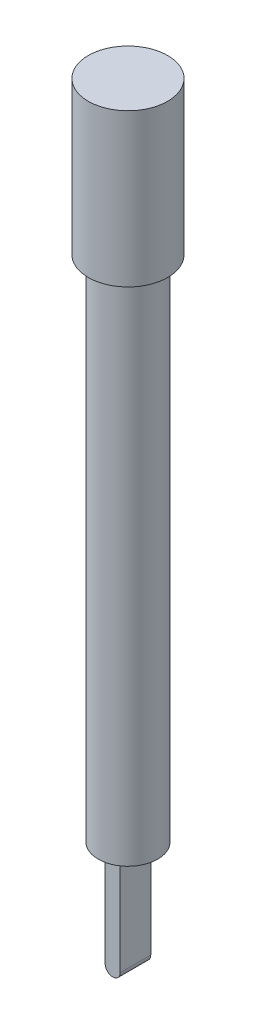
ISO-10303-21;
HEADER;
FILE_DESCRIPTION(('STEP AP214'),'2;1');
FILE_NAME('part.step','',(''),(''),'','','');
FILE_SCHEMA(('AUTOMOTIVE_DESIGN { 1 0 10303 214 1 1 1 1 }'));
ENDSEC;
DATA;
#1=APPLICATION_CONTEXT('core data for automotive mechanical design processes');
#2=APPLICATION_PROTOCOL_DEFINITION('international standard','automotive_design',2000,#1);
#3=PRODUCT_CONTEXT('',#1,'mechanical');
#4=PRODUCT('Part','Part','',(#3));
#5=PRODUCT_RELATED_PRODUCT_CATEGORY('part','',(#4));
#6=PRODUCT_DEFINITION_FORMATION('','',#4);
#7=PRODUCT_DEFINITION_CONTEXT('part definition',#1,'design');
#8=PRODUCT_DEFINITION('design','',#6,#7);
#9=PRODUCT_DEFINITION_SHAPE('','',#8);
#10=(LENGTH_UNIT() NAMED_UNIT(*) SI_UNIT(.MILLI.,.METRE.));
#11=(NAMED_UNIT(*) PLANE_ANGLE_UNIT() SI_UNIT($,.RADIAN.));
#12=(NAMED_UNIT(*) SI_UNIT($,.STERADIAN.) SOLID_ANGLE_UNIT());
#13=UNCERTAINTY_MEASURE_WITH_UNIT(LENGTH_MEASURE(1.E-05),#10,'distance_accuracy_value','');
#14=(GEOMETRIC_REPRESENTATION_CONTEXT(3) GLOBAL_UNCERTAINTY_ASSIGNED_CONTEXT((#13)) GLOBAL_UNIT_ASSIGNED_CONTEXT((#10,
#11,#12)) REPRESENTATION_CONTEXT('',''));
#15=CARTESIAN_POINT('',(0.,0.,0.));
#16=DIRECTION('',(0.,0.,1.));
#17=DIRECTION('',(1.,0.,0.));
#18=AXIS2_PLACEMENT_3D('',#15,#16,#17);
#19=CARTESIAN_POINT('',(0.,100.,0.));
#20=DIRECTION('',(0.,-1.,0.));
#21=DIRECTION('',(0.,0.,-1.));
#22=AXIS2_PLACEMENT_3D('',#19,#20,#21);
#23=CYLINDRICAL_SURFACE('',#22,5.85);
#24=CARTESIAN_POINT('',(0.,100.,0.));
#25=DIRECTION('',(0.,1.,0.));
#26=DIRECTION('',(0.,0.,1.));
#27=AXIS2_PLACEMENT_3D('',#24,#25,#26);
#28=CIRCLE('',#27,5.85);
#29=CARTESIAN_POINT('',(0.,100.,5.85));
#30=VERTEX_POINT('',#29);
#31=EDGE_CURVE('E11',#30,#30,#28,.T.);
#32=ORIENTED_EDGE('',*,*,#31,.F.);
#33=EDGE_LOOP('',(#32));
#34=FACE_BOUND('',#33,.T.);
#35=CARTESIAN_POINT('',(0.,0.,0.));
#36=DIRECTION('',(0.,1.,0.));
#37=DIRECTION('',(0.,0.,1.));
#38=AXIS2_PLACEMENT_3D('',#35,#36,#37);
#39=CIRCLE('',#38,5.85);
#40=CARTESIAN_POINT('',(0.,0.,5.85));
#41=VERTEX_POINT('',#40);
#42=EDGE_CURVE('E38',#41,#41,#39,.T.);
#43=ORIENTED_EDGE('',*,*,#42,.T.);
#44=EDGE_LOOP('',(#43));
#45=FACE_BOUND('',#44,.T.);
#46=ADVANCED_FACE('F35',(#34,#45),#23,.T.);
#47=CARTESIAN_POINT('',(0.,0.,0.));
#48=DIRECTION('',(0.,1.,0.));
#49=DIRECTION('',(0.,0.,1.));
#50=AXIS2_PLACEMENT_3D('',#47,#48,#49);
#51=PLANE('',#50);
#52=DIRECTION('',(1.,0.,0.));
#53=VECTOR('',#52,1.);
#54=CARTESIAN_POINT('',(0.,0.,-3.));
#55=LINE('',#54,#53);
#56=CARTESIAN_POINT('',(-1.47838716267318,0.,-3.));
#57=VERTEX_POINT('',#56);
#58=CARTESIAN_POINT('',(1.47838716267318,0.,-3.));
#59=VERTEX_POINT('',#58);
#60=EDGE_CURVE('E84',#57,#59,#55,.T.);
#61=ORIENTED_EDGE('',*,*,#60,.F.);
#62=DIRECTION('',(0.,0.,1.));
#63=VECTOR('',#62,1.);
#64=CARTESIAN_POINT('',(-1.47838716267318,0.,-3.));
#65=LINE('',#64,#63);
#66=CARTESIAN_POINT('',(-1.47838716267318,0.,3.));
#67=VERTEX_POINT('',#66);
#68=EDGE_CURVE('E49',#57,#67,#65,.T.);
#69=ORIENTED_EDGE('',*,*,#68,.T.);
#70=DIRECTION('',(1.,0.,0.));
#71=VECTOR('',#70,1.);
#72=CARTESIAN_POINT('',(0.,0.,3.));
#73=LINE('',#72,#71);
#74=CARTESIAN_POINT('',(1.47838716267318,0.,3.));
#75=VERTEX_POINT('',#74);
#76=EDGE_CURVE('E54',#67,#75,#73,.T.);
#77=ORIENTED_EDGE('',*,*,#76,.T.);
#78=DIRECTION('',(0.,0.,1.));
#79=VECTOR('',#78,1.);
#80=CARTESIAN_POINT('',(1.47838716267318,0.,-3.));
#81=LINE('',#80,#79);
#82=EDGE_CURVE('E109',#59,#75,#81,.T.);
#83=ORIENTED_EDGE('',*,*,#82,.F.);
#84=EDGE_LOOP('',(#61,#69,#77,#83));
#85=FACE_BOUND('',#84,.T.);
#86=ORIENTED_EDGE('',*,*,#42,.F.);
#87=EDGE_LOOP('',(#86));
#88=FACE_BOUND('',#87,.T.);
#89=ADVANCED_FACE('F135',(#85,#88),#51,.F.);
#90=CARTESIAN_POINT('',(0.,130.,0.));
#91=DIRECTION('',(0.,-1.,0.));
#92=DIRECTION('',(0.,0.,-1.));
#93=AXIS2_PLACEMENT_3D('',#90,#91,#92);
#94=CYLINDRICAL_SURFACE('',#93,7.8);
#95=CARTESIAN_POINT('',(0.,130.,0.));
#96=DIRECTION('',(0.,1.,0.));
#97=DIRECTION('',(0.,0.,1.));
#98=AXIS2_PLACEMENT_3D('',#95,#96,#97);
#99=CIRCLE('',#98,7.8);
#100=CARTESIAN_POINT('',(0.,130.,7.8));
#101=VERTEX_POINT('',#100);
#102=EDGE_CURVE('E112',#101,#101,#99,.T.);
#103=ORIENTED_EDGE('',*,*,#102,.F.);
#104=EDGE_LOOP('',(#103));
#105=FACE_BOUND('',#104,.T.);
#106=CARTESIAN_POINT('',(0.,100.,0.));
#107=DIRECTION('',(0.,1.,0.));
#108=DIRECTION('',(0.,0.,1.));
#109=AXIS2_PLACEMENT_3D('',#106,#107,#108);
#110=CIRCLE('',#109,7.8);
#111=CARTESIAN_POINT('',(0.,100.,7.8));
#112=VERTEX_POINT('',#111);
#113=EDGE_CURVE('E108',#112,#112,#110,.T.);
#114=ORIENTED_EDGE('',*,*,#113,.T.);
#115=EDGE_LOOP('',(#114));
#116=FACE_BOUND('',#115,.T.);
#117=ADVANCED_FACE('F118',(#105,#116),#94,.T.);
#118=CARTESIAN_POINT('',(0.,130.,0.));
#119=DIRECTION('',(0.,1.,0.));
#120=DIRECTION('',(0.,0.,1.));
#121=AXIS2_PLACEMENT_3D('',#118,#119,#120);
#122=PLANE('',#121);
#123=ORIENTED_EDGE('',*,*,#102,.T.);
#124=EDGE_LOOP('',(#123));
#125=FACE_BOUND('',#124,.T.);
#126=ADVANCED_FACE('F122',(#125),#122,.T.);
#127=CARTESIAN_POINT('',(0.,100.,0.));
#128=DIRECTION('',(0.,1.,0.));
#129=DIRECTION('',(0.,0.,1.));
#130=AXIS2_PLACEMENT_3D('',#127,#128,#129);
#131=PLANE('',#130);
#132=ORIENTED_EDGE('',*,*,#31,.T.);
#133=EDGE_LOOP('',(#132));
#134=FACE_BOUND('',#133,.T.);
#135=ORIENTED_EDGE('',*,*,#113,.F.);
#136=EDGE_LOOP('',(#135));
#137=FACE_BOUND('',#136,.T.);
#138=ADVANCED_FACE('F120',(#134,#137),#131,.F.);
#139=CARTESIAN_POINT('',(-1.47838716267318,0.,-3.));
#140=DIRECTION('',(1.,0.,0.));
#141=DIRECTION('',(0.,1.,0.));
#142=AXIS2_PLACEMENT_3D('',#139,#140,#141);
#143=PLANE('',#142);
#144=DIRECTION('',(0.,0.,1.));
#145=VECTOR('',#144,1.);
#146=CARTESIAN_POINT('',(-1.47838716267318,-20.,-3.));
#147=LINE('',#146,#145);
#148=CARTESIAN_POINT('',(-1.47838716267318,-20.,-3.));
#149=VERTEX_POINT('',#148);
#150=CARTESIAN_POINT('',(-1.47838716267318,-20.,3.));
#151=VERTEX_POINT('',#150);
#152=EDGE_CURVE('E73',#149,#151,#147,.T.);
#153=ORIENTED_EDGE('',*,*,#152,.T.);
#154=DIRECTION('',(0.,1.,0.));
#155=VECTOR('',#154,1.);
#156=CARTESIAN_POINT('',(-1.47838716267318,0.,3.));
#157=LINE('',#156,#155);
#158=EDGE_CURVE('E77',#151,#67,#157,.T.);
#159=ORIENTED_EDGE('',*,*,#158,.T.);
#160=ORIENTED_EDGE('',*,*,#68,.F.);
#161=DIRECTION('',(0.,1.,0.));
#162=VECTOR('',#161,1.);
#163=CARTESIAN_POINT('',(-1.47838716267318,0.,-3.));
#164=LINE('',#163,#162);
#165=EDGE_CURVE('E79',#149,#57,#164,.T.);
#166=ORIENTED_EDGE('',*,*,#165,.F.);
#167=EDGE_LOOP('',(#153,#159,#160,#166));
#168=FACE_BOUND('',#167,.T.);
#169=ADVANCED_FACE('F75',(#168),#143,.F.);
#170=CARTESIAN_POINT('',(1.47838716267318,0.,-3.));
#171=DIRECTION('',(-1.,0.,0.));
#172=DIRECTION('',(0.,-1.,0.));
#173=AXIS2_PLACEMENT_3D('',#170,#171,#172);
#174=PLANE('',#173);
#175=ORIENTED_EDGE('',*,*,#82,.T.);
#176=DIRECTION('',(0.,-1.,0.));
#177=VECTOR('',#176,1.);
#178=CARTESIAN_POINT('',(1.47838716267318,0.,3.));
#179=LINE('',#178,#177);
#180=CARTESIAN_POINT('',(1.47838716267318,-20.,3.));
#181=VERTEX_POINT('',#180);
#182=EDGE_CURVE('E93',#75,#181,#179,.T.);
#183=ORIENTED_EDGE('',*,*,#182,.T.);
#184=DIRECTION('',(0.,0.,1.));
#185=VECTOR('',#184,1.);
#186=CARTESIAN_POINT('',(1.47838716267318,-20.,-3.));
#187=LINE('',#186,#185);
#188=CARTESIAN_POINT('',(1.47838716267318,-20.,-3.));
#189=VERTEX_POINT('',#188);
#190=EDGE_CURVE('E83',#189,#181,#187,.T.);
#191=ORIENTED_EDGE('',*,*,#190,.F.);
#192=DIRECTION('',(0.,-1.,0.));
#193=VECTOR('',#192,1.);
#194=CARTESIAN_POINT('',(1.47838716267318,0.,-3.));
#195=LINE('',#194,#193);
#196=EDGE_CURVE('E103',#59,#189,#195,.T.);
#197=ORIENTED_EDGE('',*,*,#196,.F.);
#198=EDGE_LOOP('',(#175,#183,#191,#197));
#199=FACE_BOUND('',#198,.T.);
#200=ADVANCED_FACE('F129',(#199),#174,.F.);
#201=CARTESIAN_POINT('',(0.,-20.,-3.));
#202=DIRECTION('',(0.,0.,1.));
#203=DIRECTION('',(1.,0.,0.));
#204=AXIS2_PLACEMENT_3D('',#201,#202,#203);
#205=CYLINDRICAL_SURFACE('',#204,1.47838716267318);
#206=ORIENTED_EDGE('',*,*,#190,.T.);
#207=CARTESIAN_POINT('',(0.,-20.,3.));
#208=DIRECTION('',(0.,0.,1.));
#209=DIRECTION('',(1.,0.,0.));
#210=AXIS2_PLACEMENT_3D('',#207,#208,#209);
#211=CIRCLE('',#210,1.47838716267318);
#212=EDGE_CURVE('E87',#151,#181,#211,.T.);
#213=ORIENTED_EDGE('',*,*,#212,.F.);
#214=ORIENTED_EDGE('',*,*,#152,.F.);
#215=CARTESIAN_POINT('',(0.,-20.,-3.));
#216=DIRECTION('',(0.,0.,1.));
#217=DIRECTION('',(1.,0.,0.));
#218=AXIS2_PLACEMENT_3D('',#215,#216,#217);
#219=CIRCLE('',#218,1.47838716267318);
#220=EDGE_CURVE('E101',#149,#189,#219,.T.);
#221=ORIENTED_EDGE('',*,*,#220,.T.);
#222=EDGE_LOOP('',(#206,#213,#214,#221));
#223=FACE_BOUND('',#222,.T.);
#224=ADVANCED_FACE('F88',(#223),#205,.T.);
#225=CARTESIAN_POINT('',(0.,0.,-3.));
#226=DIRECTION('',(0.,0.,1.));
#227=DIRECTION('',(1.,0.,0.));
#228=AXIS2_PLACEMENT_3D('',#225,#226,#227);
#229=PLANE('',#228);
#230=ORIENTED_EDGE('',*,*,#165,.T.);
#231=ORIENTED_EDGE('',*,*,#60,.T.);
#232=ORIENTED_EDGE('',*,*,#196,.T.);
#233=ORIENTED_EDGE('',*,*,#220,.F.);
#234=EDGE_LOOP('',(#230,#231,#232,#233));
#235=FACE_BOUND('',#234,.T.);
#236=ADVANCED_FACE('F152',(#235),#229,.F.);
#237=CARTESIAN_POINT('',(0.,0.,3.));
#238=DIRECTION('',(0.,0.,1.));
#239=DIRECTION('',(1.,0.,0.));
#240=AXIS2_PLACEMENT_3D('',#237,#238,#239);
#241=PLANE('',#240);
#242=ORIENTED_EDGE('',*,*,#158,.F.);
#243=ORIENTED_EDGE('',*,*,#212,.T.);
#244=ORIENTED_EDGE('',*,*,#182,.F.);
#245=ORIENTED_EDGE('',*,*,#76,.F.);
#246=EDGE_LOOP('',(#242,#243,#244,#245));
#247=FACE_BOUND('',#246,.T.);
#248=ADVANCED_FACE('F95',(#247),#241,.T.);
#249=CLOSED_SHELL('',(#46,#89,#117,#126,#138,#169,#200,#224,#236,#248));
#250=MANIFOLD_SOLID_BREP('B2',#249);
#251=ADVANCED_BREP_SHAPE_REPRESENTATION('',(#18,#250),#14);
#252=SHAPE_DEFINITION_REPRESENTATION(#9,#251);
ENDSEC;
END-ISO-10303-21;
